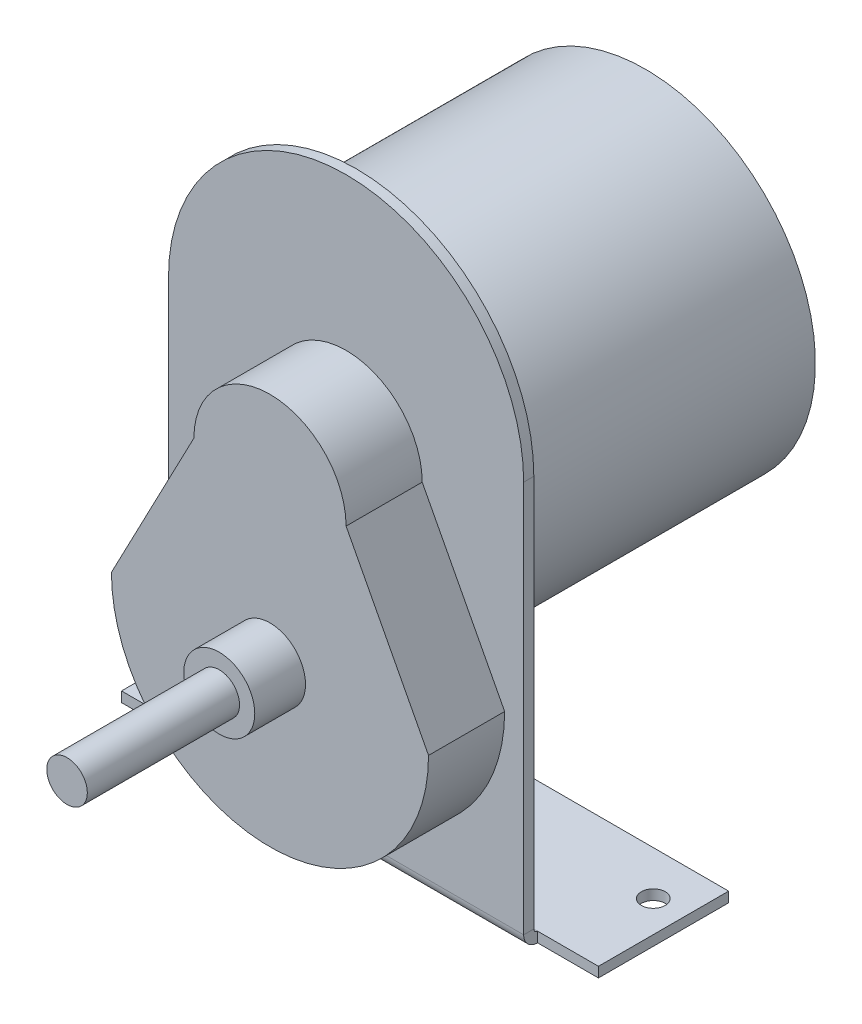
ISO-10303-21;
HEADER;
FILE_DESCRIPTION(('STEP AP214'),'2;1');
FILE_NAME('part.step','',(''),(''),'','','');
FILE_SCHEMA(('AUTOMOTIVE_DESIGN { 1 0 10303 214 1 1 1 1 }'));
ENDSEC;
DATA;
#1=APPLICATION_CONTEXT('core data for automotive mechanical design processes');
#2=APPLICATION_PROTOCOL_DEFINITION('international standard','automotive_design',2000,#1);
#3=PRODUCT_CONTEXT('',#1,'mechanical');
#4=PRODUCT('Part','Part','',(#3));
#5=PRODUCT_RELATED_PRODUCT_CATEGORY('part','',(#4));
#6=PRODUCT_DEFINITION_FORMATION('','',#4);
#7=PRODUCT_DEFINITION_CONTEXT('part definition',#1,'design');
#8=PRODUCT_DEFINITION('design','',#6,#7);
#9=PRODUCT_DEFINITION_SHAPE('','',#8);
#10=(LENGTH_UNIT() NAMED_UNIT(*) SI_UNIT(.MILLI.,.METRE.));
#11=(NAMED_UNIT(*) PLANE_ANGLE_UNIT() SI_UNIT($,.RADIAN.));
#12=(NAMED_UNIT(*) SI_UNIT($,.STERADIAN.) SOLID_ANGLE_UNIT());
#13=UNCERTAINTY_MEASURE_WITH_UNIT(LENGTH_MEASURE(1.E-05),#10,'distance_accuracy_value','');
#14=(GEOMETRIC_REPRESENTATION_CONTEXT(3) GLOBAL_UNCERTAINTY_ASSIGNED_CONTEXT((#13)) GLOBAL_UNIT_ASSIGNED_CONTEXT((#10,
#11,#12)) REPRESENTATION_CONTEXT('',''));
#15=CARTESIAN_POINT('',(0.,0.,0.));
#16=DIRECTION('',(0.,0.,1.));
#17=DIRECTION('',(1.,0.,0.));
#18=AXIS2_PLACEMENT_3D('',#15,#16,#17);
#19=CARTESIAN_POINT('',(0.,10.,59.));
#20=DIRECTION('',(0.,0.,1.));
#21=DIRECTION('',(1.,0.,0.));
#22=AXIS2_PLACEMENT_3D('',#19,#20,#21);
#23=PLANE('',#22);
#24=DIRECTION('',(0.,-1.,0.));
#25=VECTOR('',#24,1.);
#26=CARTESIAN_POINT('',(-35.,10.,59.));
#27=LINE('',#26,#25);
#28=CARTESIAN_POINT('',(-35.,10.,59.));
#29=VERTEX_POINT('',#28);
#30=CARTESIAN_POINT('',(-35.,-67.2634,59.));
#31=VERTEX_POINT('',#30);
#32=EDGE_CURVE('E271',#29,#31,#27,.T.);
#33=ORIENTED_EDGE('',*,*,#32,.T.);
#34=DIRECTION('',(-1.,0.,0.));
#35=VECTOR('',#34,1.);
#36=CARTESIAN_POINT('',(-35.,-67.2634,59.));
#37=LINE('',#36,#35);
#38=CARTESIAN_POINT('',(35.,-67.2634,59.));
#39=VERTEX_POINT('',#38);
#40=EDGE_CURVE('E238',#31,#39,#37,.F.);
#41=ORIENTED_EDGE('',*,*,#40,.T.);
#42=DIRECTION('',(0.,1.,0.));
#43=VECTOR('',#42,1.);
#44=CARTESIAN_POINT('',(35.,-70.,59.));
#45=LINE('',#44,#43);
#46=CARTESIAN_POINT('',(35.,10.,59.));
#47=VERTEX_POINT('',#46);
#48=EDGE_CURVE('E275',#39,#47,#45,.T.);
#49=ORIENTED_EDGE('',*,*,#48,.T.);
#50=CARTESIAN_POINT('',(0.,10.,59.));
#51=DIRECTION('',(0.,0.,1.));
#52=DIRECTION('',(1.,0.,0.));
#53=AXIS2_PLACEMENT_3D('',#50,#51,#52);
#54=CIRCLE('',#53,35.);
#55=EDGE_CURVE('E268',#47,#29,#54,.T.);
#56=ORIENTED_EDGE('',*,*,#55,.T.);
#57=EDGE_LOOP('',(#33,#41,#49,#56));
#58=FACE_BOUND('',#57,.T.);
#59=DIRECTION('',(-0.464116488567382,0.885774172709886,0.));
#60=VECTOR('',#59,1.);
#61=CARTESIAN_POINT('',(15.,0.,59.));
#62=LINE('',#61,#60);
#63=CARTESIAN_POINT('',(31.25,-31.0134,59.));
#64=VERTEX_POINT('',#63);
#65=CARTESIAN_POINT('',(15.,0.,59.));
#66=VERTEX_POINT('',#65);
#67=EDGE_CURVE('E314',#64,#66,#62,.T.);
#68=ORIENTED_EDGE('',*,*,#67,.F.);
#69=CARTESIAN_POINT('',(0.,-31.0134,59.));
#70=DIRECTION('',(0.,0.,1.));
#71=DIRECTION('',(1.,0.,0.));
#72=AXIS2_PLACEMENT_3D('',#69,#70,#71);
#73=CIRCLE('',#72,31.25);
#74=CARTESIAN_POINT('',(-31.25,-31.0134,59.));
#75=VERTEX_POINT('',#74);
#76=EDGE_CURVE('E198',#75,#64,#73,.T.);
#77=ORIENTED_EDGE('',*,*,#76,.F.);
#78=DIRECTION('',(-0.464116488567382,-0.885774172709886,0.));
#79=VECTOR('',#78,1.);
#80=CARTESIAN_POINT('',(-31.25,-31.0134,59.));
#81=LINE('',#80,#79);
#82=CARTESIAN_POINT('',(-15.,0.,59.));
#83=VERTEX_POINT('',#82);
#84=EDGE_CURVE('E194',#83,#75,#81,.T.);
#85=ORIENTED_EDGE('',*,*,#84,.F.);
#86=CARTESIAN_POINT('',(0.,0.,59.));
#87=DIRECTION('',(0.,0.,1.));
#88=DIRECTION('',(1.,0.,0.));
#89=AXIS2_PLACEMENT_3D('',#86,#87,#88);
#90=CIRCLE('',#89,15.);
#91=EDGE_CURVE('E316',#66,#83,#90,.T.);
#92=ORIENTED_EDGE('',*,*,#91,.F.);
#93=EDGE_LOOP('',(#68,#77,#85,#92));
#94=FACE_BOUND('',#93,.T.);
#95=ADVANCED_FACE('F72',(#58,#94),#23,.T.);
#96=CARTESIAN_POINT('',(-35.,10.,59.));
#97=DIRECTION('',(1.,0.,0.));
#98=DIRECTION('',(0.,0.,-1.));
#99=AXIS2_PLACEMENT_3D('',#96,#97,#98);
#100=PLANE('',#99);
#101=DIRECTION('',(0.,0.,1.));
#102=VECTOR('',#101,1.);
#103=CARTESIAN_POINT('',(-35.,-67.2634,57.));
#104=LINE('',#103,#102);
#105=CARTESIAN_POINT('',(-35.,-67.2634,57.));
#106=VERTEX_POINT('',#105);
#107=EDGE_CURVE('E243',#106,#31,#104,.T.);
#108=ORIENTED_EDGE('',*,*,#107,.T.);
#109=ORIENTED_EDGE('',*,*,#32,.F.);
#110=DIRECTION('',(0.,0.,-1.));
#111=VECTOR('',#110,1.);
#112=CARTESIAN_POINT('',(-35.,10.,59.));
#113=LINE('',#112,#111);
#114=CARTESIAN_POINT('',(-35.,10.,57.));
#115=VERTEX_POINT('',#114);
#116=EDGE_CURVE('E286',#29,#115,#113,.T.);
#117=ORIENTED_EDGE('',*,*,#116,.T.);
#118=DIRECTION('',(0.,-1.,0.));
#119=VECTOR('',#118,1.);
#120=CARTESIAN_POINT('',(-35.,10.,57.));
#121=LINE('',#120,#119);
#122=EDGE_CURVE('E280',#115,#106,#121,.T.);
#123=ORIENTED_EDGE('',*,*,#122,.T.);
#124=EDGE_LOOP('',(#108,#109,#117,#123));
#125=FACE_BOUND('',#124,.T.);
#126=ADVANCED_FACE('F336',(#125),#100,.F.);
#127=CARTESIAN_POINT('',(35.,-70.,59.));
#128=DIRECTION('',(-1.,0.,0.));
#129=DIRECTION('',(0.,-1.,0.));
#130=AXIS2_PLACEMENT_3D('',#127,#128,#129);
#131=PLANE('',#130);
#132=DIRECTION('',(0.,0.,1.));
#133=VECTOR('',#132,1.);
#134=CARTESIAN_POINT('',(35.,-67.2634,57.));
#135=LINE('',#134,#133);
#136=CARTESIAN_POINT('',(35.,-67.2634,57.));
#137=VERTEX_POINT('',#136);
#138=EDGE_CURVE('E258',#137,#39,#135,.T.);
#139=ORIENTED_EDGE('',*,*,#138,.F.);
#140=DIRECTION('',(0.,1.,0.));
#141=VECTOR('',#140,1.);
#142=CARTESIAN_POINT('',(35.,-70.,57.));
#143=LINE('',#142,#141);
#144=CARTESIAN_POINT('',(35.,10.,57.));
#145=VERTEX_POINT('',#144);
#146=EDGE_CURVE('E272',#137,#145,#143,.T.);
#147=ORIENTED_EDGE('',*,*,#146,.T.);
#148=DIRECTION('',(0.,0.,-1.));
#149=VECTOR('',#148,1.);
#150=CARTESIAN_POINT('',(35.,10.,59.));
#151=LINE('',#150,#149);
#152=EDGE_CURVE('E277',#47,#145,#151,.T.);
#153=ORIENTED_EDGE('',*,*,#152,.F.);
#154=ORIENTED_EDGE('',*,*,#48,.F.);
#155=EDGE_LOOP('',(#139,#147,#153,#154));
#156=FACE_BOUND('',#155,.T.);
#157=ADVANCED_FACE('F342',(#156),#131,.F.);
#158=CARTESIAN_POINT('',(0.,10.,57.));
#159=DIRECTION('',(0.,0.,1.));
#160=DIRECTION('',(1.,0.,0.));
#161=AXIS2_PLACEMENT_3D('',#158,#159,#160);
#162=PLANE('',#161);
#163=DIRECTION('',(-1.,0.,0.));
#164=VECTOR('',#163,1.);
#165=CARTESIAN_POINT('',(-35.,-67.2634,57.));
#166=LINE('',#165,#164);
#167=EDGE_CURVE('E252',#106,#137,#166,.F.);
#168=ORIENTED_EDGE('',*,*,#167,.F.);
#169=ORIENTED_EDGE('',*,*,#122,.F.);
#170=CARTESIAN_POINT('',(0.,10.,57.));
#171=DIRECTION('',(0.,0.,1.));
#172=DIRECTION('',(1.,0.,0.));
#173=AXIS2_PLACEMENT_3D('',#170,#171,#172);
#174=CIRCLE('',#173,35.);
#175=EDGE_CURVE('E265',#145,#115,#174,.T.);
#176=ORIENTED_EDGE('',*,*,#175,.F.);
#177=ORIENTED_EDGE('',*,*,#146,.F.);
#178=EDGE_LOOP('',(#168,#169,#176,#177));
#179=FACE_BOUND('',#178,.T.);
#180=ADVANCED_FACE('F348',(#179),#162,.F.);
#181=CARTESIAN_POINT('',(0.,10.,59.));
#182=DIRECTION('',(0.,0.,-1.));
#183=DIRECTION('',(-1.,0.,0.));
#184=AXIS2_PLACEMENT_3D('',#181,#182,#183);
#185=CYLINDRICAL_SURFACE('',#184,35.);
#186=ORIENTED_EDGE('',*,*,#175,.T.);
#187=ORIENTED_EDGE('',*,*,#116,.F.);
#188=ORIENTED_EDGE('',*,*,#55,.F.);
#189=ORIENTED_EDGE('',*,*,#152,.T.);
#190=EDGE_LOOP('',(#186,#187,#188,#189));
#191=FACE_BOUND('',#190,.T.);
#192=ADVANCED_FACE('F74',(#191),#185,.T.);
#193=CARTESIAN_POINT('',(35.,-67.2634,56.2634));
#194=DIRECTION('',(1.,0.,0.));
#195=DIRECTION('',(0.,0.,-1.));
#196=AXIS2_PLACEMENT_3D('',#193,#194,#195);
#197=PLANE('',#196);
#198=DIRECTION('',(0.,-1.,0.));
#199=VECTOR('',#198,1.);
#200=CARTESIAN_POINT('',(35.,-68.,56.2634));
#201=LINE('',#200,#199);
#202=CARTESIAN_POINT('',(35.,-68.,56.2634));
#203=VERTEX_POINT('',#202);
#204=CARTESIAN_POINT('',(35.,-70.,56.2634));
#205=VERTEX_POINT('',#204);
#206=EDGE_CURVE('E260',#203,#205,#201,.T.);
#207=ORIENTED_EDGE('',*,*,#206,.F.);
#208=CARTESIAN_POINT('',(35.,-67.2634,56.2634));
#209=DIRECTION('',(-1.,0.,0.));
#210=DIRECTION('',(0.,0.,1.));
#211=AXIS2_PLACEMENT_3D('',#208,#209,#210);
#212=CIRCLE('',#211,0.736600000000004);
#213=EDGE_CURVE('E247',#137,#203,#212,.F.);
#214=ORIENTED_EDGE('',*,*,#213,.F.);
#215=ORIENTED_EDGE('',*,*,#138,.T.);
#216=CARTESIAN_POINT('',(35.,-67.2634,56.2634));
#217=DIRECTION('',(-1.,0.,0.));
#218=DIRECTION('',(0.,0.,1.));
#219=AXIS2_PLACEMENT_3D('',#216,#217,#218);
#220=CIRCLE('',#219,2.7366);
#221=EDGE_CURVE('E97',#39,#205,#220,.F.);
#222=ORIENTED_EDGE('',*,*,#221,.T.);
#223=EDGE_LOOP('',(#207,#214,#215,#222));
#224=FACE_BOUND('',#223,.T.);
#225=ADVANCED_FACE('F362',(#224),#197,.T.);
#226=CARTESIAN_POINT('',(-35.,-67.2634,56.2634));
#227=DIRECTION('',(1.,0.,0.));
#228=DIRECTION('',(0.,0.,-1.));
#229=AXIS2_PLACEMENT_3D('',#226,#227,#228);
#230=PLANE('',#229);
#231=CARTESIAN_POINT('',(-35.,-67.2634,56.2634));
#232=DIRECTION('',(-1.,0.,0.));
#233=DIRECTION('',(0.,0.,1.));
#234=AXIS2_PLACEMENT_3D('',#231,#232,#233);
#235=CIRCLE('',#234,0.736600000000004);
#236=CARTESIAN_POINT('',(-35.,-68.,56.2634));
#237=VERTEX_POINT('',#236);
#238=EDGE_CURVE('E254',#237,#106,#235,.T.);
#239=ORIENTED_EDGE('',*,*,#238,.F.);
#240=DIRECTION('',(0.,-1.,0.));
#241=VECTOR('',#240,1.);
#242=CARTESIAN_POINT('',(-35.,-68.,56.2634));
#243=LINE('',#242,#241);
#244=CARTESIAN_POINT('',(-35.,-70.,56.2634));
#245=VERTEX_POINT('',#244);
#246=EDGE_CURVE('E263',#237,#245,#243,.T.);
#247=ORIENTED_EDGE('',*,*,#246,.T.);
#248=CARTESIAN_POINT('',(-35.,-67.2634,56.2634));
#249=DIRECTION('',(-1.,0.,0.));
#250=DIRECTION('',(0.,0.,1.));
#251=AXIS2_PLACEMENT_3D('',#248,#249,#250);
#252=CIRCLE('',#251,2.7366);
#253=EDGE_CURVE('E241',#245,#31,#252,.T.);
#254=ORIENTED_EDGE('',*,*,#253,.T.);
#255=ORIENTED_EDGE('',*,*,#107,.F.);
#256=EDGE_LOOP('',(#239,#247,#254,#255));
#257=FACE_BOUND('',#256,.T.);
#258=ADVANCED_FACE('F346',(#257),#230,.F.);
#259=CARTESIAN_POINT('',(-35.,-67.2634,56.2634));
#260=DIRECTION('',(-1.,0.,0.));
#261=DIRECTION('',(0.,-1.,0.));
#262=AXIS2_PLACEMENT_3D('',#259,#260,#261);
#263=CYLINDRICAL_SURFACE('',#262,2.7366);
#264=ORIENTED_EDGE('',*,*,#40,.F.);
#265=ORIENTED_EDGE('',*,*,#253,.F.);
#266=DIRECTION('',(-1.,0.,0.));
#267=VECTOR('',#266,1.);
#268=CARTESIAN_POINT('',(-35.,-70.,56.2634));
#269=LINE('',#268,#267);
#270=EDGE_CURVE('E244',#205,#245,#269,.T.);
#271=ORIENTED_EDGE('',*,*,#270,.F.);
#272=ORIENTED_EDGE('',*,*,#221,.F.);
#273=EDGE_LOOP('',(#264,#265,#271,#272));
#274=FACE_BOUND('',#273,.T.);
#275=ADVANCED_FACE('F364',(#274),#263,.T.);
#276=CARTESIAN_POINT('',(-35.,-67.2634,56.2634));
#277=DIRECTION('',(-1.,0.,0.));
#278=DIRECTION('',(0.,-1.,0.));
#279=AXIS2_PLACEMENT_3D('',#276,#277,#278);
#280=CYLINDRICAL_SURFACE('',#279,0.736600000000004);
#281=ORIENTED_EDGE('',*,*,#167,.T.);
#282=ORIENTED_EDGE('',*,*,#213,.T.);
#283=DIRECTION('',(-1.,0.,0.));
#284=VECTOR('',#283,1.);
#285=CARTESIAN_POINT('',(-35.,-68.,56.2634));
#286=LINE('',#285,#284);
#287=EDGE_CURVE('E211',#203,#237,#286,.T.);
#288=ORIENTED_EDGE('',*,*,#287,.T.);
#289=ORIENTED_EDGE('',*,*,#238,.T.);
#290=EDGE_LOOP('',(#281,#282,#288,#289));
#291=FACE_BOUND('',#290,.T.);
#292=ADVANCED_FACE('F372',(#291),#280,.F.);
#293=CARTESIAN_POINT('',(47.,-68.,56.2634));
#294=DIRECTION('',(0.,0.,1.));
#295=DIRECTION('',(0.,-1.,0.));
#296=AXIS2_PLACEMENT_3D('',#293,#294,#295);
#297=PLANE('',#296);
#298=ORIENTED_EDGE('',*,*,#246,.F.);
#299=DIRECTION('',(-1.,0.,0.));
#300=VECTOR('',#299,1.);
#301=CARTESIAN_POINT('',(47.,-68.,56.2634));
#302=LINE('',#301,#300);
#303=CARTESIAN_POINT('',(-47.,-68.,56.2634));
#304=VERTEX_POINT('',#303);
#305=EDGE_CURVE('E203',#237,#304,#302,.T.);
#306=ORIENTED_EDGE('',*,*,#305,.T.);
#307=DIRECTION('',(0.,1.,0.));
#308=VECTOR('',#307,1.);
#309=CARTESIAN_POINT('',(-47.,-68.,56.2634));
#310=LINE('',#309,#308);
#311=CARTESIAN_POINT('',(-47.,-70.,56.2634));
#312=VERTEX_POINT('',#311);
#313=EDGE_CURVE('E233',#304,#312,#310,.F.);
#314=ORIENTED_EDGE('',*,*,#313,.T.);
#315=DIRECTION('',(-1.,0.,0.));
#316=VECTOR('',#315,1.);
#317=CARTESIAN_POINT('',(47.,-70.,56.2634));
#318=LINE('',#317,#316);
#319=EDGE_CURVE('E229',#312,#245,#318,.F.);
#320=ORIENTED_EDGE('',*,*,#319,.T.);
#321=EDGE_LOOP('',(#298,#306,#314,#320));
#322=FACE_BOUND('',#321,.T.);
#323=ADVANCED_FACE('F376',(#322),#297,.T.);
#324=CARTESIAN_POINT('',(-47.,-70.0000000000001,30.6));
#325=DIRECTION('',(1.,0.,0.));
#326=DIRECTION('',(0.,0.,-1.));
#327=AXIS2_PLACEMENT_3D('',#324,#325,#326);
#328=PLANE('',#327);
#329=ORIENTED_EDGE('',*,*,#313,.F.);
#330=DIRECTION('',(0.,0.,1.));
#331=VECTOR('',#330,1.);
#332=CARTESIAN_POINT('',(-47.,-68.0000000000001,30.6));
#333=LINE('',#332,#331);
#334=CARTESIAN_POINT('',(-47.,-68.0000000000001,30.6));
#335=VERTEX_POINT('',#334);
#336=EDGE_CURVE('E227',#304,#335,#333,.F.);
#337=ORIENTED_EDGE('',*,*,#336,.T.);
#338=DIRECTION('',(0.,1.,0.));
#339=VECTOR('',#338,1.);
#340=CARTESIAN_POINT('',(-47.,-70.0000000000001,30.6));
#341=LINE('',#340,#339);
#342=CARTESIAN_POINT('',(-47.,-70.0000000000001,30.6));
#343=VERTEX_POINT('',#342);
#344=EDGE_CURVE('E208',#343,#335,#341,.T.);
#345=ORIENTED_EDGE('',*,*,#344,.F.);
#346=DIRECTION('',(0.,0.,-1.));
#347=VECTOR('',#346,1.);
#348=CARTESIAN_POINT('',(-47.,-70.0000000000002,2.64563115171213E-13));
#349=LINE('',#348,#347);
#350=EDGE_CURVE('E220',#312,#343,#349,.T.);
#351=ORIENTED_EDGE('',*,*,#350,.F.);
#352=EDGE_LOOP('',(#329,#337,#345,#351));
#353=FACE_BOUND('',#352,.T.);
#354=ADVANCED_FACE('F387',(#353),#328,.F.);
#355=CARTESIAN_POINT('',(47.,-70.,57.));
#356=DIRECTION('',(-1.,0.,0.));
#357=DIRECTION('',(0.,0.,1.));
#358=AXIS2_PLACEMENT_3D('',#355,#356,#357);
#359=PLANE('',#358);
#360=DIRECTION('',(0.,1.,0.));
#361=VECTOR('',#360,1.);
#362=CARTESIAN_POINT('',(47.,-70.,56.2634));
#363=LINE('',#362,#361);
#364=CARTESIAN_POINT('',(47.,-68.,56.2634));
#365=VERTEX_POINT('',#364);
#366=CARTESIAN_POINT('',(47.,-70.,56.2634));
#367=VERTEX_POINT('',#366);
#368=EDGE_CURVE('E200',#365,#367,#363,.F.);
#369=ORIENTED_EDGE('',*,*,#368,.T.);
#370=DIRECTION('',(0.,0.,1.));
#371=VECTOR('',#370,1.);
#372=CARTESIAN_POINT('',(47.,-70.0000000000002,2.64563115171213E-13));
#373=LINE('',#372,#371);
#374=CARTESIAN_POINT('',(47.,-70.0000000000001,30.6));
#375=VERTEX_POINT('',#374);
#376=EDGE_CURVE('E215',#375,#367,#373,.T.);
#377=ORIENTED_EDGE('',*,*,#376,.F.);
#378=DIRECTION('',(0.,1.,0.));
#379=VECTOR('',#378,1.);
#380=CARTESIAN_POINT('',(47.,-70.0000000000001,30.6));
#381=LINE('',#380,#379);
#382=CARTESIAN_POINT('',(47.,-68.0000000000001,30.6));
#383=VERTEX_POINT('',#382);
#384=EDGE_CURVE('E212',#375,#383,#381,.T.);
#385=ORIENTED_EDGE('',*,*,#384,.T.);
#386=DIRECTION('',(0.,0.,-1.));
#387=VECTOR('',#386,1.);
#388=CARTESIAN_POINT('',(47.,-68.,57.));
#389=LINE('',#388,#387);
#390=EDGE_CURVE('E222',#383,#365,#389,.F.);
#391=ORIENTED_EDGE('',*,*,#390,.T.);
#392=EDGE_LOOP('',(#369,#377,#385,#391));
#393=FACE_BOUND('',#392,.T.);
#394=ADVANCED_FACE('F396',(#393),#359,.F.);
#395=CARTESIAN_POINT('',(0.,-70.0000000000002,2.64563115171213E-13));
#396=DIRECTION('',(0.,1.,0.));
#397=DIRECTION('',(0.,0.,1.));
#398=AXIS2_PLACEMENT_3D('',#395,#396,#397);
#399=PLANE('',#398);
#400=CARTESIAN_POINT('',(40.85,-70.0000000000001,39.3));
#401=DIRECTION('',(0.,-1.,0.));
#402=DIRECTION('',(0.,0.,-1.));
#403=AXIS2_PLACEMENT_3D('',#400,#401,#402);
#404=CIRCLE('',#403,2.35);
#405=CARTESIAN_POINT('',(40.85,-70.0000000000001,36.95));
#406=VERTEX_POINT('',#405);
#407=EDGE_CURVE('E290',#406,#406,#404,.T.);
#408=ORIENTED_EDGE('',*,*,#407,.F.);
#409=EDGE_LOOP('',(#408));
#410=FACE_BOUND('',#409,.T.);
#411=CARTESIAN_POINT('',(-40.85,-70.0000000000001,39.3));
#412=DIRECTION('',(0.,-1.,0.));
#413=DIRECTION('',(0.,0.,-1.));
#414=AXIS2_PLACEMENT_3D('',#411,#412,#413);
#415=CIRCLE('',#414,2.35);
#416=CARTESIAN_POINT('',(-40.85,-70.0000000000001,36.95));
#417=VERTEX_POINT('',#416);
#418=EDGE_CURVE('E296',#417,#417,#415,.T.);
#419=ORIENTED_EDGE('',*,*,#418,.F.);
#420=EDGE_LOOP('',(#419));
#421=FACE_BOUND('',#420,.T.);
#422=ORIENTED_EDGE('',*,*,#319,.F.);
#423=ORIENTED_EDGE('',*,*,#350,.T.);
#424=DIRECTION('',(1.,0.,0.));
#425=VECTOR('',#424,1.);
#426=CARTESIAN_POINT('',(0.,-70.0000000000001,30.6));
#427=LINE('',#426,#425);
#428=EDGE_CURVE('E218',#343,#375,#427,.T.);
#429=ORIENTED_EDGE('',*,*,#428,.T.);
#430=ORIENTED_EDGE('',*,*,#376,.T.);
#431=EDGE_CURVE('E232',#205,#367,#318,.F.);
#432=ORIENTED_EDGE('',*,*,#431,.F.);
#433=ORIENTED_EDGE('',*,*,#270,.T.);
#434=EDGE_LOOP('',(#422,#423,#429,#430,#432,#433));
#435=FACE_BOUND('',#434,.T.);
#436=ADVANCED_FACE('F390',(#410,#421,#435),#399,.F.);
#437=CARTESIAN_POINT('',(0.,-68.0000000000002,2.57580152493527E-13));
#438=DIRECTION('',(0.,1.,0.));
#439=DIRECTION('',(0.,0.,1.));
#440=AXIS2_PLACEMENT_3D('',#437,#438,#439);
#441=PLANE('',#440);
#442=CARTESIAN_POINT('',(40.85,-68.0000000000001,39.3));
#443=DIRECTION('',(0.,1.,0.));
#444=DIRECTION('',(0.,0.,1.));
#445=AXIS2_PLACEMENT_3D('',#442,#443,#444);
#446=CIRCLE('',#445,2.35);
#447=CARTESIAN_POINT('',(40.85,-68.0000000000001,41.65));
#448=VERTEX_POINT('',#447);
#449=EDGE_CURVE('E76',#448,#448,#446,.T.);
#450=ORIENTED_EDGE('',*,*,#449,.F.);
#451=EDGE_LOOP('',(#450));
#452=FACE_BOUND('',#451,.T.);
#453=CARTESIAN_POINT('',(-40.85,-68.0000000000001,39.3));
#454=DIRECTION('',(0.,1.,0.));
#455=DIRECTION('',(0.,0.,1.));
#456=AXIS2_PLACEMENT_3D('',#453,#454,#455);
#457=CIRCLE('',#456,2.35);
#458=CARTESIAN_POINT('',(-40.85,-68.0000000000001,41.65));
#459=VERTEX_POINT('',#458);
#460=EDGE_CURVE('E288',#459,#459,#457,.T.);
#461=ORIENTED_EDGE('',*,*,#460,.F.);
#462=EDGE_LOOP('',(#461));
#463=FACE_BOUND('',#462,.T.);
#464=ORIENTED_EDGE('',*,*,#336,.F.);
#465=ORIENTED_EDGE('',*,*,#305,.F.);
#466=ORIENTED_EDGE('',*,*,#287,.F.);
#467=EDGE_CURVE('E235',#365,#203,#302,.T.);
#468=ORIENTED_EDGE('',*,*,#467,.F.);
#469=ORIENTED_EDGE('',*,*,#390,.F.);
#470=DIRECTION('',(-1.,0.,0.));
#471=VECTOR('',#470,1.);
#472=CARTESIAN_POINT('',(47.,-68.0000000000001,30.6));
#473=LINE('',#472,#471);
#474=EDGE_CURVE('E225',#335,#383,#473,.F.);
#475=ORIENTED_EDGE('',*,*,#474,.F.);
#476=EDGE_LOOP('',(#464,#465,#466,#468,#469,#475));
#477=FACE_BOUND('',#476,.T.);
#478=ADVANCED_FACE('F381',(#452,#463,#477),#441,.T.);
#479=CARTESIAN_POINT('',(47.,-70.0000000000001,30.6));
#480=DIRECTION('',(0.,0.,1.));
#481=DIRECTION('',(0.,-1.,0.));
#482=AXIS2_PLACEMENT_3D('',#479,#480,#481);
#483=PLANE('',#482);
#484=ORIENTED_EDGE('',*,*,#474,.T.);
#485=ORIENTED_EDGE('',*,*,#384,.F.);
#486=ORIENTED_EDGE('',*,*,#428,.F.);
#487=ORIENTED_EDGE('',*,*,#344,.T.);
#488=EDGE_LOOP('',(#484,#485,#486,#487));
#489=FACE_BOUND('',#488,.T.);
#490=ADVANCED_FACE('F400',(#489),#483,.F.);
#491=ORIENTED_EDGE('',*,*,#467,.T.);
#492=ORIENTED_EDGE('',*,*,#206,.T.);
#493=ORIENTED_EDGE('',*,*,#431,.T.);
#494=ORIENTED_EDGE('',*,*,#368,.F.);
#495=EDGE_LOOP('',(#491,#492,#493,#494));
#496=FACE_BOUND('',#495,.T.);
#497=ADVANCED_FACE('F394',(#496),#297,.T.);
#498=CARTESIAN_POINT('',(0.,-31.0134,74.));
#499=DIRECTION('',(0.,0.,-1.));
#500=DIRECTION('',(-1.,0.,0.));
#501=AXIS2_PLACEMENT_3D('',#498,#499,#500);
#502=CYLINDRICAL_SURFACE('',#501,31.25);
#503=ORIENTED_EDGE('',*,*,#76,.T.);
#504=DIRECTION('',(0.,0.,-1.));
#505=VECTOR('',#504,1.);
#506=CARTESIAN_POINT('',(31.25,-31.0134,74.));
#507=LINE('',#506,#505);
#508=CARTESIAN_POINT('',(31.25,-31.0134,74.));
#509=VERTEX_POINT('',#508);
#510=EDGE_CURVE('E179',#509,#64,#507,.T.);
#511=ORIENTED_EDGE('',*,*,#510,.F.);
#512=CARTESIAN_POINT('',(0.,-31.0134,74.));
#513=DIRECTION('',(0.,0.,1.));
#514=DIRECTION('',(1.,0.,0.));
#515=AXIS2_PLACEMENT_3D('',#512,#513,#514);
#516=CIRCLE('',#515,31.25);
#517=CARTESIAN_POINT('',(-31.25,-31.0134,74.));
#518=VERTEX_POINT('',#517);
#519=EDGE_CURVE('E186',#518,#509,#516,.T.);
#520=ORIENTED_EDGE('',*,*,#519,.F.);
#521=DIRECTION('',(0.,0.,-1.));
#522=VECTOR('',#521,1.);
#523=CARTESIAN_POINT('',(-31.25,-31.0134,74.));
#524=LINE('',#523,#522);
#525=EDGE_CURVE('E312',#518,#75,#524,.T.);
#526=ORIENTED_EDGE('',*,*,#525,.T.);
#527=EDGE_LOOP('',(#503,#511,#520,#526));
#528=FACE_BOUND('',#527,.T.);
#529=ADVANCED_FACE('F196',(#528),#502,.T.);
#530=CARTESIAN_POINT('',(15.,0.,74.));
#531=DIRECTION('',(-0.885774172709886,-0.464116488567382,0.));
#532=DIRECTION('',(0.464116488567382,-0.885774172709886,0.));
#533=AXIS2_PLACEMENT_3D('',#530,#531,#532);
#534=PLANE('',#533);
#535=ORIENTED_EDGE('',*,*,#67,.T.);
#536=DIRECTION('',(0.,0.,-1.));
#537=VECTOR('',#536,1.);
#538=CARTESIAN_POINT('',(15.,0.,74.));
#539=LINE('',#538,#537);
#540=CARTESIAN_POINT('',(15.,0.,74.));
#541=VERTEX_POINT('',#540);
#542=EDGE_CURVE('E182',#541,#66,#539,.T.);
#543=ORIENTED_EDGE('',*,*,#542,.F.);
#544=DIRECTION('',(-0.464116488567382,0.885774172709886,0.));
#545=VECTOR('',#544,1.);
#546=CARTESIAN_POINT('',(15.,0.,74.));
#547=LINE('',#546,#545);
#548=EDGE_CURVE('E175',#509,#541,#547,.T.);
#549=ORIENTED_EDGE('',*,*,#548,.F.);
#550=ORIENTED_EDGE('',*,*,#510,.T.);
#551=EDGE_LOOP('',(#535,#543,#549,#550));
#552=FACE_BOUND('',#551,.T.);
#553=ADVANCED_FACE('F177',(#552),#534,.F.);
#554=CARTESIAN_POINT('',(0.,0.,74.));
#555=DIRECTION('',(0.,0.,-1.));
#556=DIRECTION('',(-1.,0.,0.));
#557=AXIS2_PLACEMENT_3D('',#554,#555,#556);
#558=CYLINDRICAL_SURFACE('',#557,15.);
#559=ORIENTED_EDGE('',*,*,#91,.T.);
#560=DIRECTION('',(0.,0.,-1.));
#561=VECTOR('',#560,1.);
#562=CARTESIAN_POINT('',(-15.,0.,74.));
#563=LINE('',#562,#561);
#564=CARTESIAN_POINT('',(-15.,0.,74.));
#565=VERTEX_POINT('',#564);
#566=EDGE_CURVE('E89',#565,#83,#563,.T.);
#567=ORIENTED_EDGE('',*,*,#566,.F.);
#568=CARTESIAN_POINT('',(0.,0.,74.));
#569=DIRECTION('',(0.,0.,1.));
#570=DIRECTION('',(1.,0.,0.));
#571=AXIS2_PLACEMENT_3D('',#568,#569,#570);
#572=CIRCLE('',#571,15.);
#573=EDGE_CURVE('E185',#541,#565,#572,.T.);
#574=ORIENTED_EDGE('',*,*,#573,.F.);
#575=ORIENTED_EDGE('',*,*,#542,.T.);
#576=EDGE_LOOP('',(#559,#567,#574,#575));
#577=FACE_BOUND('',#576,.T.);
#578=ADVANCED_FACE('F323',(#577),#558,.T.);
#579=CARTESIAN_POINT('',(-31.25,-31.0134,74.));
#580=DIRECTION('',(0.885774172709886,-0.464116488567382,0.));
#581=DIRECTION('',(0.464116488567382,0.885774172709886,0.));
#582=AXIS2_PLACEMENT_3D('',#579,#580,#581);
#583=PLANE('',#582);
#584=ORIENTED_EDGE('',*,*,#84,.T.);
#585=ORIENTED_EDGE('',*,*,#525,.F.);
#586=DIRECTION('',(-0.464116488567382,-0.885774172709886,0.));
#587=VECTOR('',#586,1.);
#588=CARTESIAN_POINT('',(-31.25,-31.0134,74.));
#589=LINE('',#588,#587);
#590=EDGE_CURVE('E190',#565,#518,#589,.T.);
#591=ORIENTED_EDGE('',*,*,#590,.F.);
#592=ORIENTED_EDGE('',*,*,#566,.T.);
#593=EDGE_LOOP('',(#584,#585,#591,#592));
#594=FACE_BOUND('',#593,.T.);
#595=ADVANCED_FACE('F324',(#594),#583,.F.);
#596=CARTESIAN_POINT('',(0.,-31.0134,74.));
#597=DIRECTION('',(0.,0.,1.));
#598=DIRECTION('',(1.,0.,0.));
#599=AXIS2_PLACEMENT_3D('',#596,#597,#598);
#600=PLANE('',#599);
#601=CARTESIAN_POINT('',(0.,-31.0134,74.));
#602=DIRECTION('',(0.,0.,1.));
#603=DIRECTION('',(1.,0.,0.));
#604=AXIS2_PLACEMENT_3D('',#601,#602,#603);
#605=CIRCLE('',#604,7.);
#606=CARTESIAN_POINT('',(7.,-31.0134,74.));
#607=VERTEX_POINT('',#606);
#608=EDGE_CURVE('E81',#607,#607,#605,.T.);
#609=ORIENTED_EDGE('',*,*,#608,.F.);
#610=EDGE_LOOP('',(#609));
#611=FACE_BOUND('',#610,.T.);
#612=ORIENTED_EDGE('',*,*,#519,.T.);
#613=ORIENTED_EDGE('',*,*,#548,.T.);
#614=ORIENTED_EDGE('',*,*,#573,.T.);
#615=ORIENTED_EDGE('',*,*,#590,.T.);
#616=EDGE_LOOP('',(#612,#613,#614,#615));
#617=FACE_BOUND('',#616,.T.);
#618=ADVANCED_FACE('F189',(#611,#617),#600,.T.);
#619=CARTESIAN_POINT('',(0.,-31.0134,84.));
#620=DIRECTION('',(0.,0.,-1.));
#621=DIRECTION('',(-1.,0.,0.));
#622=AXIS2_PLACEMENT_3D('',#619,#620,#621);
#623=CYLINDRICAL_SURFACE('',#622,7.);
#624=CARTESIAN_POINT('',(0.,-31.0134,84.));
#625=DIRECTION('',(0.,0.,1.));
#626=DIRECTION('',(1.,0.,0.));
#627=AXIS2_PLACEMENT_3D('',#624,#625,#626);
#628=CIRCLE('',#627,7.);
#629=CARTESIAN_POINT('',(7.,-31.0134,84.));
#630=VERTEX_POINT('',#629);
#631=EDGE_CURVE('E304',#630,#630,#628,.T.);
#632=ORIENTED_EDGE('',*,*,#631,.F.);
#633=EDGE_LOOP('',(#632));
#634=FACE_BOUND('',#633,.T.);
#635=ORIENTED_EDGE('',*,*,#608,.T.);
#636=EDGE_LOOP('',(#635));
#637=FACE_BOUND('',#636,.T.);
#638=ADVANCED_FACE('F331',(#634,#637),#623,.T.);
#639=CARTESIAN_POINT('',(0.,-31.0134,84.));
#640=DIRECTION('',(0.,0.,1.));
#641=DIRECTION('',(1.,0.,0.));
#642=AXIS2_PLACEMENT_3D('',#639,#640,#641);
#643=PLANE('',#642);
#644=CARTESIAN_POINT('',(0.,-31.0134,84.));
#645=DIRECTION('',(0.,0.,1.));
#646=DIRECTION('',(1.,0.,0.));
#647=AXIS2_PLACEMENT_3D('',#644,#645,#646);
#648=CIRCLE('',#647,4.);
#649=CARTESIAN_POINT('',(4.,-31.0134,84.));
#650=VERTEX_POINT('',#649);
#651=EDGE_CURVE('E14',#650,#650,#648,.T.);
#652=ORIENTED_EDGE('',*,*,#651,.F.);
#653=EDGE_LOOP('',(#652));
#654=FACE_BOUND('',#653,.T.);
#655=ORIENTED_EDGE('',*,*,#631,.T.);
#656=EDGE_LOOP('',(#655));
#657=FACE_BOUND('',#656,.T.);
#658=ADVANCED_FACE('F550',(#654,#657),#643,.T.);
#659=CARTESIAN_POINT('',(0.,-31.0134,114.));
#660=DIRECTION('',(0.,0.,-1.));
#661=DIRECTION('',(-1.,0.,0.));
#662=AXIS2_PLACEMENT_3D('',#659,#660,#661);
#663=CYLINDRICAL_SURFACE('',#662,4.);
#664=CARTESIAN_POINT('',(0.,-31.0134,114.));
#665=DIRECTION('',(0.,0.,1.));
#666=DIRECTION('',(1.,0.,0.));
#667=AXIS2_PLACEMENT_3D('',#664,#665,#666);
#668=CIRCLE('',#667,4.);
#669=CARTESIAN_POINT('',(4.,-31.0134,114.));
#670=VERTEX_POINT('',#669);
#671=EDGE_CURVE('E294',#670,#670,#668,.T.);
#672=ORIENTED_EDGE('',*,*,#671,.F.);
#673=EDGE_LOOP('',(#672));
#674=FACE_BOUND('',#673,.T.);
#675=ORIENTED_EDGE('',*,*,#651,.T.);
#676=EDGE_LOOP('',(#675));
#677=FACE_BOUND('',#676,.T.);
#678=ADVANCED_FACE('F561',(#674,#677),#663,.T.);
#679=CARTESIAN_POINT('',(0.,-31.0134,114.));
#680=DIRECTION('',(0.,0.,1.));
#681=DIRECTION('',(1.,0.,0.));
#682=AXIS2_PLACEMENT_3D('',#679,#680,#681);
#683=PLANE('',#682);
#684=ORIENTED_EDGE('',*,*,#671,.T.);
#685=EDGE_LOOP('',(#684));
#686=FACE_BOUND('',#685,.T.);
#687=ADVANCED_FACE('F572',(#686),#683,.T.);
#688=CARTESIAN_POINT('',(-40.85,-65.0000000000001,39.3));
#689=DIRECTION('',(0.,-1.,0.));
#690=DIRECTION('',(0.,0.,-1.));
#691=AXIS2_PLACEMENT_3D('',#688,#689,#690);
#692=CYLINDRICAL_SURFACE('',#691,2.35);
#693=ORIENTED_EDGE('',*,*,#460,.T.);
#694=EDGE_LOOP('',(#693));
#695=FACE_BOUND('',#694,.T.);
#696=ORIENTED_EDGE('',*,*,#418,.T.);
#697=EDGE_LOOP('',(#696));
#698=FACE_BOUND('',#697,.T.);
#699=ADVANCED_FACE('F583',(#695,#698),#692,.F.);
#700=CARTESIAN_POINT('',(40.85,-65.0000000000001,39.3));
#701=DIRECTION('',(0.,-1.,0.));
#702=DIRECTION('',(0.,0.,-1.));
#703=AXIS2_PLACEMENT_3D('',#700,#701,#702);
#704=CYLINDRICAL_SURFACE('',#703,2.35);
#705=ORIENTED_EDGE('',*,*,#449,.T.);
#706=EDGE_LOOP('',(#705));
#707=FACE_BOUND('',#706,.T.);
#708=ORIENTED_EDGE('',*,*,#407,.T.);
#709=EDGE_LOOP('',(#708));
#710=FACE_BOUND('',#709,.T.);
#711=ADVANCED_FACE('F608',(#707,#710),#704,.F.);
#712=CLOSED_SHELL('',(#95,#126,#157,#180,#192,#225,#258,#275,#292,#323,#354,#394,#436,#478,#490,
#497,#529,#553,#578,#595,#618,#638,#658,#678,#687,#699,#711));
#713=MANIFOLD_SOLID_BREP('B2',#712);
#714=CARTESIAN_POINT('',(0.,0.,57.));
#715=DIRECTION('',(0.,0.,-1.));
#716=DIRECTION('',(-1.,0.,0.));
#717=AXIS2_PLACEMENT_3D('',#714,#715,#716);
#718=CYLINDRICAL_SURFACE('',#717,33.5);
#719=CARTESIAN_POINT('',(0.,0.,57.));
#720=DIRECTION('',(0.,0.,1.));
#721=DIRECTION('',(1.,0.,0.));
#722=AXIS2_PLACEMENT_3D('',#719,#720,#721);
#723=CIRCLE('',#722,33.5);
#724=CARTESIAN_POINT('',(-33.5,0.,57.));
#725=VERTEX_POINT('',#724);
#726=EDGE_CURVE('E71',#725,#725,#723,.T.);
#727=CARTESIAN_POINT('',(0.,0.,0.));
#728=DIRECTION('',(0.,0.,1.));
#729=DIRECTION('',(1.,0.,0.));
#730=AXIS2_PLACEMENT_3D('',#727,#728,#729);
#731=CIRCLE('',#730,33.5);
#732=CARTESIAN_POINT('',(-33.5,0.,0.));
#733=VERTEX_POINT('',#732);
#734=EDGE_CURVE('E710',#733,#733,#731,.T.);
#735=CARTESIAN_POINT('',(-33.5,0.,57.));
#736=CARTESIAN_POINT('',(-33.5,0.,56.40625));
#737=CARTESIAN_POINT('',(-33.5,0.,55.8125));
#738=CARTESIAN_POINT('',(-33.5,0.,54.625));
#739=CARTESIAN_POINT('',(-33.5,0.,54.03125));
#740=CARTESIAN_POINT('',(-33.5,0.,52.84375));
#741=CARTESIAN_POINT('',(-33.5,0.,52.25));
#742=CARTESIAN_POINT('',(-33.5,0.,51.0625));
#743=CARTESIAN_POINT('',(-33.5,0.,50.46875));
#744=CARTESIAN_POINT('',(-33.5,0.,49.28125));
#745=CARTESIAN_POINT('',(-33.5,0.,48.6875));
#746=CARTESIAN_POINT('',(-33.5,0.,47.5));
#747=CARTESIAN_POINT('',(-33.5,0.,46.90625));
#748=CARTESIAN_POINT('',(-33.5,0.,45.71875));
#749=CARTESIAN_POINT('',(-33.5,0.,45.125));
#750=CARTESIAN_POINT('',(-33.5,0.,43.9375));
#751=CARTESIAN_POINT('',(-33.5,0.,43.34375));
#752=CARTESIAN_POINT('',(-33.5,0.,42.15625));
#753=CARTESIAN_POINT('',(-33.5,0.,41.5625));
#754=CARTESIAN_POINT('',(-33.5,0.,40.375));
#755=CARTESIAN_POINT('',(-33.5,0.,39.78125));
#756=CARTESIAN_POINT('',(-33.5,0.,38.59375));
#757=CARTESIAN_POINT('',(-33.5,0.,38.));
#758=CARTESIAN_POINT('',(-33.5,0.,36.8125));
#759=CARTESIAN_POINT('',(-33.5,0.,36.21875));
#760=CARTESIAN_POINT('',(-33.5,0.,35.03125));
#761=CARTESIAN_POINT('',(-33.5,0.,34.4375));
#762=CARTESIAN_POINT('',(-33.5,0.,33.25));
#763=CARTESIAN_POINT('',(-33.5,0.,32.65625));
#764=CARTESIAN_POINT('',(-33.5,0.,31.46875));
#765=CARTESIAN_POINT('',(-33.5,0.,30.875));
#766=CARTESIAN_POINT('',(-33.5,0.,29.6875));
#767=CARTESIAN_POINT('',(-33.5,0.,29.09375));
#768=CARTESIAN_POINT('',(-33.5,0.,27.90625));
#769=CARTESIAN_POINT('',(-33.5,0.,27.3125));
#770=CARTESIAN_POINT('',(-33.5,0.,26.125));
#771=CARTESIAN_POINT('',(-33.5,0.,25.53125));
#772=CARTESIAN_POINT('',(-33.5,0.,24.34375));
#773=CARTESIAN_POINT('',(-33.5,0.,23.75));
#774=CARTESIAN_POINT('',(-33.5,0.,22.5625));
#775=CARTESIAN_POINT('',(-33.5,0.,21.96875));
#776=CARTESIAN_POINT('',(-33.5,0.,20.78125));
#777=CARTESIAN_POINT('',(-33.5,0.,20.1875));
#778=CARTESIAN_POINT('',(-33.5,0.,19.));
#779=CARTESIAN_POINT('',(-33.5,0.,18.40625));
#780=CARTESIAN_POINT('',(-33.5,0.,17.21875));
#781=CARTESIAN_POINT('',(-33.5,0.,16.625));
#782=CARTESIAN_POINT('',(-33.5,0.,15.4375));
#783=CARTESIAN_POINT('',(-33.5,0.,14.84375));
#784=CARTESIAN_POINT('',(-33.5,0.,13.65625));
#785=CARTESIAN_POINT('',(-33.5,0.,13.0625));
#786=CARTESIAN_POINT('',(-33.5,0.,11.875));
#787=CARTESIAN_POINT('',(-33.5,0.,11.28125));
#788=CARTESIAN_POINT('',(-33.5,0.,10.09375));
#789=CARTESIAN_POINT('',(-33.5,0.,9.5));
#790=CARTESIAN_POINT('',(-33.5,0.,8.3125));
#791=CARTESIAN_POINT('',(-33.5,0.,7.71875));
#792=CARTESIAN_POINT('',(-33.5,0.,6.53125));
#793=CARTESIAN_POINT('',(-33.5,0.,5.9375));
#794=CARTESIAN_POINT('',(-33.5,0.,4.75));
#795=CARTESIAN_POINT('',(-33.5,0.,4.15625));
#796=CARTESIAN_POINT('',(-33.5,0.,2.96875));
#797=CARTESIAN_POINT('',(-33.5,0.,2.375));
#798=CARTESIAN_POINT('',(-33.5,0.,1.1875));
#799=CARTESIAN_POINT('',(-33.5,0.,0.593749999999999));
#800=CARTESIAN_POINT('',(-33.5,0.,0.));
#801=B_SPLINE_CURVE_WITH_KNOTS('',3,(#735,#736,#737,#738,#739,#740,#741,#742,#743,#744,#745,
#746,#747,#748,#749,#750,#751,#752,#753,#754,#755,#756,#757,#758,#759,#760,#761,#762,#763,#764,
#765,#766,#767,#768,#769,#770,#771,#772,#773,#774,#775,#776,#777,#778,#779,#780,#781,#782,#783,
#784,#785,#786,#787,#788,#789,#790,#791,#792,#793,#794,#795,#796,#797,#798,#799,#800),
.UNSPECIFIED.,.F.,.F.,(4,2,2,2,2,2,2,2,2,2,2,2,2,2,2,2,2,2,2,2,2,2,2,2,2,2,2,2,2,2,2,2,4),(0.,
1.78125000000001,3.5625,5.34375,7.12500000000001,8.90625,10.6875,12.46875,14.25,16.03125,
17.8125,19.59375,21.375,23.15625,24.9375,26.71875,28.5,30.28125,32.0625,33.84375,35.625,
37.40625,39.1875,40.96875,42.75,44.53125,46.3125,48.09375,49.875,51.65625,53.4375,55.21875,57.),.UNSPECIFIED.);
#802=EDGE_CURVE('BSEAM707',#725,#733,#801,.T.);
#803=ORIENTED_EDGE('',*,*,#726,.F.);
#804=ORIENTED_EDGE('',*,*,#734,.T.);
#805=ORIENTED_EDGE('',*,*,#802,.T.);
#806=ORIENTED_EDGE('',*,*,#802,.F.);
#807=EDGE_LOOP('',(#803,#805,#804,#806));
#808=FACE_BOUND('',#807,.T.);
#809=ADVANCED_FACE('F707',(#808),#718,.T.);
#810=CARTESIAN_POINT('',(0.,0.,57.));
#811=DIRECTION('',(0.,0.,1.));
#812=DIRECTION('',(1.,0.,0.));
#813=AXIS2_PLACEMENT_3D('',#810,#811,#812);
#814=PLANE('',#813);
#815=ORIENTED_EDGE('',*,*,#726,.T.);
#816=EDGE_LOOP('',(#815));
#817=FACE_BOUND('',#816,.T.);
#818=ADVANCED_FACE('F724',(#817),#814,.T.);
#819=CARTESIAN_POINT('',(0.,0.,0.));
#820=DIRECTION('',(0.,0.,1.));
#821=DIRECTION('',(1.,0.,0.));
#822=AXIS2_PLACEMENT_3D('',#819,#820,#821);
#823=PLANE('',#822);
#824=ORIENTED_EDGE('',*,*,#734,.F.);
#825=EDGE_LOOP('',(#824));
#826=FACE_BOUND('',#825,.T.);
#827=ADVANCED_FACE('F722',(#826),#823,.F.);
#828=CLOSED_SHELL('',(#809,#818,#827));
#829=MANIFOLD_SOLID_BREP('B8',#828);
#830=ADVANCED_BREP_SHAPE_REPRESENTATION('',(#18,#713,#829),#14);
#831=SHAPE_DEFINITION_REPRESENTATION(#9,#830);
ENDSEC;
END-ISO-10303-21;
